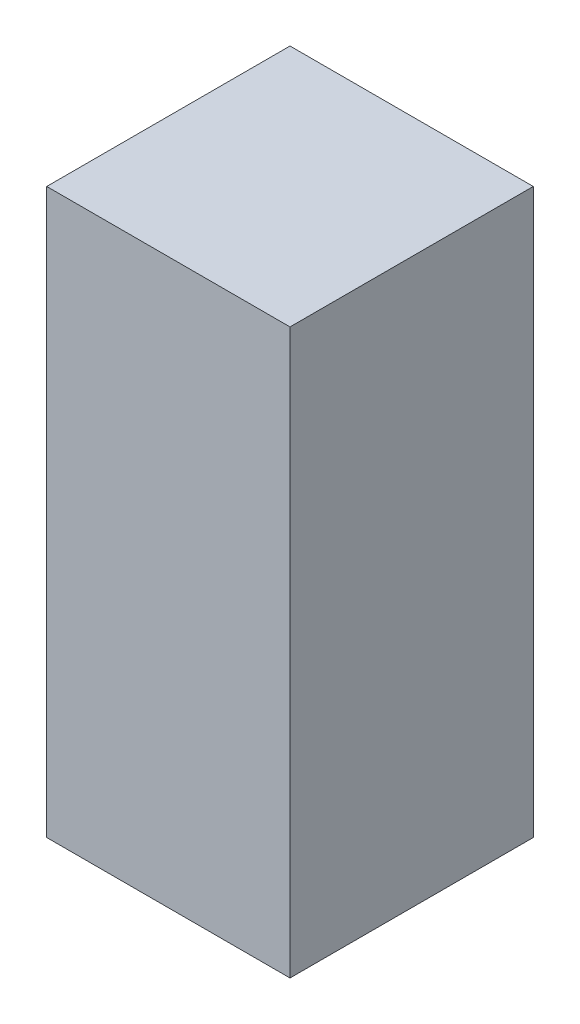
ISO-10303-21;
HEADER;
FILE_DESCRIPTION(('STEP AP214'),'2;1');
FILE_NAME('part.step','',(''),(''),'','','');
FILE_SCHEMA(('AUTOMOTIVE_DESIGN { 1 0 10303 214 1 1 1 1 }'));
ENDSEC;
DATA;
#1=APPLICATION_CONTEXT('core data for automotive mechanical design processes');
#2=APPLICATION_PROTOCOL_DEFINITION('international standard','automotive_design',2000,#1);
#3=PRODUCT_CONTEXT('',#1,'mechanical');
#4=PRODUCT('Part','Part','',(#3));
#5=PRODUCT_RELATED_PRODUCT_CATEGORY('part','',(#4));
#6=PRODUCT_DEFINITION_FORMATION('','',#4);
#7=PRODUCT_DEFINITION_CONTEXT('part definition',#1,'design');
#8=PRODUCT_DEFINITION('design','',#6,#7);
#9=PRODUCT_DEFINITION_SHAPE('','',#8);
#10=(LENGTH_UNIT() NAMED_UNIT(*) SI_UNIT(.MILLI.,.METRE.));
#11=(NAMED_UNIT(*) PLANE_ANGLE_UNIT() SI_UNIT($,.RADIAN.));
#12=(NAMED_UNIT(*) SI_UNIT($,.STERADIAN.) SOLID_ANGLE_UNIT());
#13=UNCERTAINTY_MEASURE_WITH_UNIT(LENGTH_MEASURE(1.E-05),#10,'distance_accuracy_value','');
#14=(GEOMETRIC_REPRESENTATION_CONTEXT(3) GLOBAL_UNCERTAINTY_ASSIGNED_CONTEXT((#13)) GLOBAL_UNIT_ASSIGNED_CONTEXT((#10,
#11,#12)) REPRESENTATION_CONTEXT('',''));
#15=CARTESIAN_POINT('',(0.,0.,0.));
#16=DIRECTION('',(0.,0.,1.));
#17=DIRECTION('',(1.,0.,0.));
#18=AXIS2_PLACEMENT_3D('',#15,#16,#17);
#19=CARTESIAN_POINT('',(0.,88.9,0.));
#20=DIRECTION('',(1.,0.,0.));
#21=DIRECTION('',(0.,0.,-1.));
#22=AXIS2_PLACEMENT_3D('',#19,#20,#21);
#23=PLANE('',#22);
#24=DIRECTION('',(0.,0.,1.));
#25=VECTOR('',#24,1.);
#26=CARTESIAN_POINT('',(0.,0.,0.));
#27=LINE('',#26,#25);
#28=CARTESIAN_POINT('',(0.,0.,-38.354));
#29=VERTEX_POINT('',#28);
#30=CARTESIAN_POINT('',(0.,0.,0.));
#31=VERTEX_POINT('',#30);
#32=EDGE_CURVE('E113',#29,#31,#27,.T.);
#33=ORIENTED_EDGE('',*,*,#32,.T.);
#34=DIRECTION('',(0.,-1.,0.));
#35=VECTOR('',#34,1.);
#36=CARTESIAN_POINT('',(0.,88.9,0.));
#37=LINE('',#36,#35);
#38=CARTESIAN_POINT('',(0.,88.9,0.));
#39=VERTEX_POINT('',#38);
#40=EDGE_CURVE('E11',#39,#31,#37,.T.);
#41=ORIENTED_EDGE('',*,*,#40,.F.);
#42=DIRECTION('',(0.,0.,1.));
#43=VECTOR('',#42,1.);
#44=CARTESIAN_POINT('',(0.,88.9,0.));
#45=LINE('',#44,#43);
#46=CARTESIAN_POINT('',(0.,88.9,-38.354));
#47=VERTEX_POINT('',#46);
#48=EDGE_CURVE('E97',#47,#39,#45,.T.);
#49=ORIENTED_EDGE('',*,*,#48,.F.);
#50=DIRECTION('',(0.,-1.,0.));
#51=VECTOR('',#50,1.);
#52=CARTESIAN_POINT('',(0.,88.9,-38.354));
#53=LINE('',#52,#51);
#54=EDGE_CURVE('E109',#47,#29,#53,.T.);
#55=ORIENTED_EDGE('',*,*,#54,.T.);
#56=EDGE_LOOP('',(#33,#41,#49,#55));
#57=FACE_BOUND('',#56,.T.);
#58=ADVANCED_FACE('F45',(#57),#23,.F.);
#59=CARTESIAN_POINT('',(0.,88.9,0.));
#60=DIRECTION('',(0.,0.,-1.));
#61=DIRECTION('',(-1.,0.,0.));
#62=AXIS2_PLACEMENT_3D('',#59,#60,#61);
#63=PLANE('',#62);
#64=DIRECTION('',(1.,0.,0.));
#65=VECTOR('',#64,1.);
#66=CARTESIAN_POINT('',(0.,0.,0.));
#67=LINE('',#66,#65);
#68=CARTESIAN_POINT('',(38.354,0.,0.));
#69=VERTEX_POINT('',#68);
#70=EDGE_CURVE('E102',#31,#69,#67,.T.);
#71=ORIENTED_EDGE('',*,*,#70,.T.);
#72=DIRECTION('',(0.,-1.,0.));
#73=VECTOR('',#72,1.);
#74=CARTESIAN_POINT('',(38.354,88.9,0.));
#75=LINE('',#74,#73);
#76=CARTESIAN_POINT('',(38.354,88.9,0.));
#77=VERTEX_POINT('',#76);
#78=EDGE_CURVE('E54',#77,#69,#75,.T.);
#79=ORIENTED_EDGE('',*,*,#78,.F.);
#80=DIRECTION('',(1.,0.,0.));
#81=VECTOR('',#80,1.);
#82=CARTESIAN_POINT('',(0.,88.9,0.));
#83=LINE('',#82,#81);
#84=EDGE_CURVE('E92',#39,#77,#83,.T.);
#85=ORIENTED_EDGE('',*,*,#84,.F.);
#86=ORIENTED_EDGE('',*,*,#40,.T.);
#87=EDGE_LOOP('',(#71,#79,#85,#86));
#88=FACE_BOUND('',#87,.T.);
#89=ADVANCED_FACE('F101',(#88),#63,.F.);
#90=CARTESIAN_POINT('',(38.354,88.9,0.));
#91=DIRECTION('',(-1.,0.,0.));
#92=DIRECTION('',(0.,0.,1.));
#93=AXIS2_PLACEMENT_3D('',#90,#91,#92);
#94=PLANE('',#93);
#95=DIRECTION('',(0.,0.,-1.));
#96=VECTOR('',#95,1.);
#97=CARTESIAN_POINT('',(38.354,0.,0.));
#98=LINE('',#97,#96);
#99=CARTESIAN_POINT('',(38.354,0.,-38.354));
#100=VERTEX_POINT('',#99);
#101=EDGE_CURVE('E79',#69,#100,#98,.T.);
#102=ORIENTED_EDGE('',*,*,#101,.T.);
#103=DIRECTION('',(0.,-1.,0.));
#104=VECTOR('',#103,1.);
#105=CARTESIAN_POINT('',(38.354,88.9,-38.354));
#106=LINE('',#105,#104);
#107=CARTESIAN_POINT('',(38.354,88.9,-38.354));
#108=VERTEX_POINT('',#107);
#109=EDGE_CURVE('E104',#108,#100,#106,.T.);
#110=ORIENTED_EDGE('',*,*,#109,.F.);
#111=DIRECTION('',(0.,0.,-1.));
#112=VECTOR('',#111,1.);
#113=CARTESIAN_POINT('',(38.354,88.9,0.));
#114=LINE('',#113,#112);
#115=EDGE_CURVE('E95',#77,#108,#114,.T.);
#116=ORIENTED_EDGE('',*,*,#115,.F.);
#117=ORIENTED_EDGE('',*,*,#78,.T.);
#118=EDGE_LOOP('',(#102,#110,#116,#117));
#119=FACE_BOUND('',#118,.T.);
#120=ADVANCED_FACE('F105',(#119),#94,.F.);
#121=CARTESIAN_POINT('',(0.,88.9,-38.354));
#122=DIRECTION('',(0.,0.,1.));
#123=DIRECTION('',(1.,0.,0.));
#124=AXIS2_PLACEMENT_3D('',#121,#122,#123);
#125=PLANE('',#124);
#126=DIRECTION('',(-1.,0.,0.));
#127=VECTOR('',#126,1.);
#128=CARTESIAN_POINT('',(0.,0.,-38.354));
#129=LINE('',#128,#127);
#130=EDGE_CURVE('E85',#100,#29,#129,.T.);
#131=ORIENTED_EDGE('',*,*,#130,.T.);
#132=ORIENTED_EDGE('',*,*,#54,.F.);
#133=DIRECTION('',(-1.,0.,0.));
#134=VECTOR('',#133,1.);
#135=CARTESIAN_POINT('',(0.,88.9,-38.354));
#136=LINE('',#135,#134);
#137=EDGE_CURVE('E62',#108,#47,#136,.T.);
#138=ORIENTED_EDGE('',*,*,#137,.F.);
#139=ORIENTED_EDGE('',*,*,#109,.T.);
#140=EDGE_LOOP('',(#131,#132,#138,#139));
#141=FACE_BOUND('',#140,.T.);
#142=ADVANCED_FACE('F126',(#141),#125,.F.);
#143=CARTESIAN_POINT('',(0.,88.9,0.));
#144=DIRECTION('',(0.,-1.,0.));
#145=DIRECTION('',(0.,0.,-1.));
#146=AXIS2_PLACEMENT_3D('',#143,#144,#145);
#147=PLANE('',#146);
#148=ORIENTED_EDGE('',*,*,#48,.T.);
#149=ORIENTED_EDGE('',*,*,#84,.T.);
#150=ORIENTED_EDGE('',*,*,#115,.T.);
#151=ORIENTED_EDGE('',*,*,#137,.T.);
#152=EDGE_LOOP('',(#148,#149,#150,#151));
#153=FACE_BOUND('',#152,.T.);
#154=ADVANCED_FACE('F93',(#153),#147,.F.);
#155=CARTESIAN_POINT('',(0.,0.,0.));
#156=DIRECTION('',(0.,-1.,0.));
#157=DIRECTION('',(0.,0.,-1.));
#158=AXIS2_PLACEMENT_3D('',#155,#156,#157);
#159=PLANE('',#158);
#160=ORIENTED_EDGE('',*,*,#32,.F.);
#161=ORIENTED_EDGE('',*,*,#130,.F.);
#162=ORIENTED_EDGE('',*,*,#101,.F.);
#163=ORIENTED_EDGE('',*,*,#70,.F.);
#164=EDGE_LOOP('',(#160,#161,#162,#163));
#165=FACE_BOUND('',#164,.T.);
#166=ADVANCED_FACE('F129',(#165),#159,.T.);
#167=CLOSED_SHELL('',(#58,#89,#120,#142,#154,#166));
#168=MANIFOLD_SOLID_BREP('B2',#167);
#169=ADVANCED_BREP_SHAPE_REPRESENTATION('',(#18,#168),#14);
#170=SHAPE_DEFINITION_REPRESENTATION(#9,#169);
ENDSEC;
END-ISO-10303-21;
